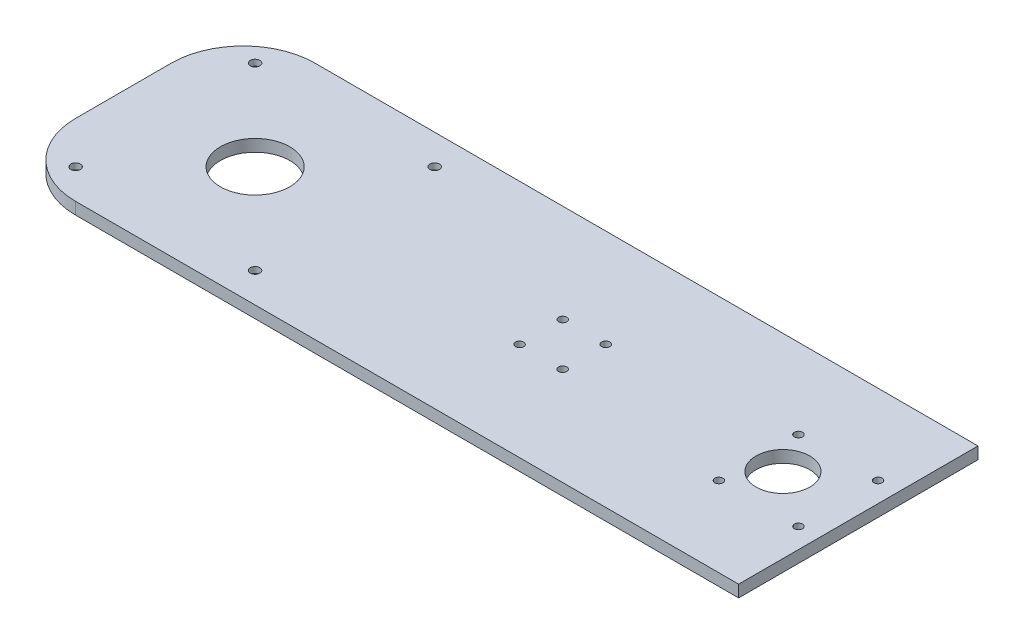
ISO-10303-21;
HEADER;
FILE_DESCRIPTION(('STEP AP214'),'2;1');
FILE_NAME('part.step','',(''),(''),'','','');
FILE_SCHEMA(('AUTOMOTIVE_DESIGN { 1 0 10303 214 1 1 1 1 }'));
ENDSEC;
DATA;
#1=APPLICATION_CONTEXT('core data for automotive mechanical design processes');
#2=APPLICATION_PROTOCOL_DEFINITION('international standard','automotive_design',2000,#1);
#3=PRODUCT_CONTEXT('',#1,'mechanical');
#4=PRODUCT('Part','Part','',(#3));
#5=PRODUCT_RELATED_PRODUCT_CATEGORY('part','',(#4));
#6=PRODUCT_DEFINITION_FORMATION('','',#4);
#7=PRODUCT_DEFINITION_CONTEXT('part definition',#1,'design');
#8=PRODUCT_DEFINITION('design','',#6,#7);
#9=PRODUCT_DEFINITION_SHAPE('','',#8);
#10=(LENGTH_UNIT() NAMED_UNIT(*) SI_UNIT(.MILLI.,.METRE.));
#11=(NAMED_UNIT(*) PLANE_ANGLE_UNIT() SI_UNIT($,.RADIAN.));
#12=(NAMED_UNIT(*) SI_UNIT($,.STERADIAN.) SOLID_ANGLE_UNIT());
#13=UNCERTAINTY_MEASURE_WITH_UNIT(LENGTH_MEASURE(1.E-05),#10,'distance_accuracy_value','');
#14=(GEOMETRIC_REPRESENTATION_CONTEXT(3) GLOBAL_UNCERTAINTY_ASSIGNED_CONTEXT((#13)) GLOBAL_UNIT_ASSIGNED_CONTEXT((#10,
#11,#12)) REPRESENTATION_CONTEXT('',''));
#15=CARTESIAN_POINT('',(0.,0.,0.));
#16=DIRECTION('',(0.,0.,1.));
#17=DIRECTION('',(1.,0.,0.));
#18=AXIS2_PLACEMENT_3D('',#15,#16,#17);
#19=CARTESIAN_POINT('',(-272.,0.,-75.));
#20=DIRECTION('',(0.,1.,0.));
#21=DIRECTION('',(0.,0.,1.));
#22=AXIS2_PLACEMENT_3D('',#19,#20,#21);
#23=CYLINDRICAL_SURFACE('',#22,3.99999999999999);
#24=CARTESIAN_POINT('',(-272.,10.,-75.));
#25=DIRECTION('',(0.,1.,0.));
#26=DIRECTION('',(0.,0.,1.));
#27=AXIS2_PLACEMENT_3D('',#24,#25,#26);
#28=CIRCLE('',#27,3.99999999999999);
#29=CARTESIAN_POINT('',(-272.,10.,-71.));
#30=VERTEX_POINT('',#29);
#31=EDGE_CURVE('E306',#30,#30,#28,.T.);
#32=ORIENTED_EDGE('',*,*,#31,.T.);
#33=EDGE_LOOP('',(#32));
#34=FACE_BOUND('',#33,.T.);
#35=CARTESIAN_POINT('',(-272.,5.,-75.));
#36=DIRECTION('',(0.,-1.,0.));
#37=DIRECTION('',(0.,0.,-1.));
#38=AXIS2_PLACEMENT_3D('',#35,#36,#37);
#39=CIRCLE('',#38,3.99999999999999);
#40=CARTESIAN_POINT('',(-272.,5.,-79.));
#41=VERTEX_POINT('',#40);
#42=EDGE_CURVE('E168',#41,#41,#39,.F.);
#43=ORIENTED_EDGE('',*,*,#42,.F.);
#44=EDGE_LOOP('',(#43));
#45=FACE_BOUND('',#44,.T.);
#46=ADVANCED_FACE('F45',(#34,#45),#23,.F.);
#47=CARTESIAN_POINT('',(-122.,0.,-75.0000000000001));
#48=DIRECTION('',(0.,1.,0.));
#49=DIRECTION('',(0.,0.,1.));
#50=AXIS2_PLACEMENT_3D('',#47,#48,#49);
#51=CYLINDRICAL_SURFACE('',#50,4.00000000000001);
#52=CARTESIAN_POINT('',(-122.,10.,-75.0000000000001));
#53=DIRECTION('',(0.,1.,0.));
#54=DIRECTION('',(0.,0.,-1.));
#55=AXIS2_PLACEMENT_3D('',#52,#53,#54);
#56=CIRCLE('',#55,4.00000000000001);
#57=CARTESIAN_POINT('',(-122.,10.,-79.0000000000001));
#58=VERTEX_POINT('',#57);
#59=EDGE_CURVE('E317',#58,#58,#56,.T.);
#60=ORIENTED_EDGE('',*,*,#59,.T.);
#61=EDGE_LOOP('',(#60));
#62=FACE_BOUND('',#61,.T.);
#63=CARTESIAN_POINT('',(-122.,5.,-75.0000000000001));
#64=DIRECTION('',(0.,-1.,0.));
#65=DIRECTION('',(0.,0.,-1.));
#66=AXIS2_PLACEMENT_3D('',#63,#64,#65);
#67=CIRCLE('',#66,4.00000000000001);
#68=CARTESIAN_POINT('',(-122.,5.,-79.0000000000001));
#69=VERTEX_POINT('',#68);
#70=EDGE_CURVE('E163',#69,#69,#67,.F.);
#71=ORIENTED_EDGE('',*,*,#70,.F.);
#72=EDGE_LOOP('',(#71));
#73=FACE_BOUND('',#72,.T.);
#74=ADVANCED_FACE('F227',(#62,#73),#51,.F.);
#75=CARTESIAN_POINT('',(-122.,0.,75.));
#76=DIRECTION('',(0.,1.,0.));
#77=DIRECTION('',(0.,0.,1.));
#78=AXIS2_PLACEMENT_3D('',#75,#76,#77);
#79=CYLINDRICAL_SURFACE('',#78,4.00000000000001);
#80=CARTESIAN_POINT('',(-122.,10.,75.));
#81=DIRECTION('',(0.,1.,0.));
#82=DIRECTION('',(0.,0.,1.));
#83=AXIS2_PLACEMENT_3D('',#80,#81,#82);
#84=CIRCLE('',#83,4.00000000000001);
#85=CARTESIAN_POINT('',(-122.,10.,79.));
#86=VERTEX_POINT('',#85);
#87=EDGE_CURVE('E313',#86,#86,#84,.T.);
#88=ORIENTED_EDGE('',*,*,#87,.T.);
#89=EDGE_LOOP('',(#88));
#90=FACE_BOUND('',#89,.T.);
#91=CARTESIAN_POINT('',(-122.,5.,75.));
#92=DIRECTION('',(0.,-1.,0.));
#93=DIRECTION('',(0.,0.,-1.));
#94=AXIS2_PLACEMENT_3D('',#91,#92,#93);
#95=CIRCLE('',#94,4.00000000000001);
#96=CARTESIAN_POINT('',(-122.,5.,71.));
#97=VERTEX_POINT('',#96);
#98=EDGE_CURVE('E159',#97,#97,#95,.F.);
#99=ORIENTED_EDGE('',*,*,#98,.F.);
#100=EDGE_LOOP('',(#99));
#101=FACE_BOUND('',#100,.T.);
#102=ADVANCED_FACE('F233',(#90,#101),#79,.F.);
#103=CARTESIAN_POINT('',(-272.,0.,75.));
#104=DIRECTION('',(0.,1.,0.));
#105=DIRECTION('',(0.,0.,1.));
#106=AXIS2_PLACEMENT_3D('',#103,#104,#105);
#107=CYLINDRICAL_SURFACE('',#106,3.99999999999999);
#108=CARTESIAN_POINT('',(-272.,10.,75.));
#109=DIRECTION('',(0.,1.,0.));
#110=DIRECTION('',(0.,0.,-1.));
#111=AXIS2_PLACEMENT_3D('',#108,#109,#110);
#112=CIRCLE('',#111,3.99999999999999);
#113=CARTESIAN_POINT('',(-272.,10.,71.));
#114=VERTEX_POINT('',#113);
#115=EDGE_CURVE('E309',#114,#114,#112,.T.);
#116=ORIENTED_EDGE('',*,*,#115,.T.);
#117=EDGE_LOOP('',(#116));
#118=FACE_BOUND('',#117,.T.);
#119=CARTESIAN_POINT('',(-272.,5.,75.));
#120=DIRECTION('',(0.,-1.,0.));
#121=DIRECTION('',(0.,0.,-1.));
#122=AXIS2_PLACEMENT_3D('',#119,#120,#121);
#123=CIRCLE('',#122,3.99999999999999);
#124=CARTESIAN_POINT('',(-272.,5.,71.));
#125=VERTEX_POINT('',#124);
#126=EDGE_CURVE('E153',#125,#125,#123,.F.);
#127=ORIENTED_EDGE('',*,*,#126,.F.);
#128=EDGE_LOOP('',(#127));
#129=FACE_BOUND('',#128,.T.);
#130=ADVANCED_FACE('F244',(#118,#129),#107,.F.);
#131=CARTESIAN_POINT('',(-307.,10.,100.));
#132=DIRECTION('',(1.,0.,0.));
#133=DIRECTION('',(0.,0.,-1.));
#134=AXIS2_PLACEMENT_3D('',#131,#132,#133);
#135=PLANE('',#134);
#136=DIRECTION('',(0.,0.,1.));
#137=VECTOR('',#136,1.);
#138=CARTESIAN_POINT('',(-307.,0.,100.));
#139=LINE('',#138,#137);
#140=CARTESIAN_POINT('',(-307.,0.,-40.));
#141=VERTEX_POINT('',#140);
#142=CARTESIAN_POINT('',(-307.,0.,40.));
#143=VERTEX_POINT('',#142);
#144=EDGE_CURVE('E133',#141,#143,#139,.T.);
#145=ORIENTED_EDGE('',*,*,#144,.T.);
#146=DIRECTION('',(0.,-1.,0.));
#147=VECTOR('',#146,1.);
#148=CARTESIAN_POINT('',(-307.,10.,40.));
#149=LINE('',#148,#147);
#150=CARTESIAN_POINT('',(-307.,10.,40.));
#151=VERTEX_POINT('',#150);
#152=EDGE_CURVE('E67',#143,#151,#149,.F.);
#153=ORIENTED_EDGE('',*,*,#152,.T.);
#154=DIRECTION('',(0.,0.,1.));
#155=VECTOR('',#154,1.);
#156=CARTESIAN_POINT('',(-307.,10.,100.));
#157=LINE('',#156,#155);
#158=CARTESIAN_POINT('',(-307.,10.,-40.));
#159=VERTEX_POINT('',#158);
#160=EDGE_CURVE('E111',#159,#151,#157,.T.);
#161=ORIENTED_EDGE('',*,*,#160,.F.);
#162=DIRECTION('',(0.,-1.,0.));
#163=VECTOR('',#162,1.);
#164=CARTESIAN_POINT('',(-307.,10.,-40.));
#165=LINE('',#164,#163);
#166=EDGE_CURVE('E197',#159,#141,#165,.T.);
#167=ORIENTED_EDGE('',*,*,#166,.T.);
#168=EDGE_LOOP('',(#145,#153,#161,#167));
#169=FACE_BOUND('',#168,.T.);
#170=ADVANCED_FACE('F209',(#169),#135,.F.);
#171=CARTESIAN_POINT('',(307.,10.,100.));
#172=DIRECTION('',(0.,0.,-1.));
#173=DIRECTION('',(-1.,0.,0.));
#174=AXIS2_PLACEMENT_3D('',#171,#172,#173);
#175=PLANE('',#174);
#176=DIRECTION('',(1.,0.,0.));
#177=VECTOR('',#176,1.);
#178=CARTESIAN_POINT('',(307.,10.,100.));
#179=LINE('',#178,#177);
#180=CARTESIAN_POINT('',(-247.,10.,100.));
#181=VERTEX_POINT('',#180);
#182=CARTESIAN_POINT('',(307.,10.,100.));
#183=VERTEX_POINT('',#182);
#184=EDGE_CURVE('E100',#181,#183,#179,.T.);
#185=ORIENTED_EDGE('',*,*,#184,.F.);
#186=DIRECTION('',(0.,-1.,0.));
#187=VECTOR('',#186,1.);
#188=CARTESIAN_POINT('',(-247.,10.,100.));
#189=LINE('',#188,#187);
#190=CARTESIAN_POINT('',(-247.,0.,100.));
#191=VERTEX_POINT('',#190);
#192=EDGE_CURVE('E121',#181,#191,#189,.T.);
#193=ORIENTED_EDGE('',*,*,#192,.T.);
#194=DIRECTION('',(1.,0.,0.));
#195=VECTOR('',#194,1.);
#196=CARTESIAN_POINT('',(307.,0.,100.));
#197=LINE('',#196,#195);
#198=CARTESIAN_POINT('',(307.,0.,100.));
#199=VERTEX_POINT('',#198);
#200=EDGE_CURVE('E117',#191,#199,#197,.T.);
#201=ORIENTED_EDGE('',*,*,#200,.T.);
#202=DIRECTION('',(0.,-1.,0.));
#203=VECTOR('',#202,1.);
#204=CARTESIAN_POINT('',(307.,10.,100.));
#205=LINE('',#204,#203);
#206=EDGE_CURVE('E114',#183,#199,#205,.T.);
#207=ORIENTED_EDGE('',*,*,#206,.F.);
#208=EDGE_LOOP('',(#185,#193,#201,#207));
#209=FACE_BOUND('',#208,.T.);
#210=ADVANCED_FACE('F115',(#209),#175,.F.);
#211=CARTESIAN_POINT('',(307.,10.,100.));
#212=DIRECTION('',(-1.,0.,0.));
#213=DIRECTION('',(0.,0.,1.));
#214=AXIS2_PLACEMENT_3D('',#211,#212,#213);
#215=PLANE('',#214);
#216=DIRECTION('',(0.,0.,-1.));
#217=VECTOR('',#216,1.);
#218=CARTESIAN_POINT('',(307.,0.,100.));
#219=LINE('',#218,#217);
#220=CARTESIAN_POINT('',(307.,0.,-100.));
#221=VERTEX_POINT('',#220);
#222=EDGE_CURVE('E139',#199,#221,#219,.T.);
#223=ORIENTED_EDGE('',*,*,#222,.T.);
#224=DIRECTION('',(0.,-1.,0.));
#225=VECTOR('',#224,1.);
#226=CARTESIAN_POINT('',(307.,10.,-100.));
#227=LINE('',#226,#225);
#228=CARTESIAN_POINT('',(307.,10.,-100.));
#229=VERTEX_POINT('',#228);
#230=EDGE_CURVE('E122',#229,#221,#227,.T.);
#231=ORIENTED_EDGE('',*,*,#230,.F.);
#232=DIRECTION('',(0.,0.,-1.));
#233=VECTOR('',#232,1.);
#234=CARTESIAN_POINT('',(307.,10.,100.));
#235=LINE('',#234,#233);
#236=EDGE_CURVE('E104',#183,#229,#235,.T.);
#237=ORIENTED_EDGE('',*,*,#236,.F.);
#238=ORIENTED_EDGE('',*,*,#206,.T.);
#239=EDGE_LOOP('',(#223,#231,#237,#238));
#240=FACE_BOUND('',#239,.T.);
#241=ADVANCED_FACE('F124',(#240),#215,.F.);
#242=CARTESIAN_POINT('',(307.,10.,-100.));
#243=DIRECTION('',(0.,0.,1.));
#244=DIRECTION('',(1.,0.,0.));
#245=AXIS2_PLACEMENT_3D('',#242,#243,#244);
#246=PLANE('',#245);
#247=DIRECTION('',(-1.,0.,0.));
#248=VECTOR('',#247,1.);
#249=CARTESIAN_POINT('',(307.,0.,-100.));
#250=LINE('',#249,#248);
#251=CARTESIAN_POINT('',(-247.,0.,-100.));
#252=VERTEX_POINT('',#251);
#253=EDGE_CURVE('E142',#221,#252,#250,.T.);
#254=ORIENTED_EDGE('',*,*,#253,.T.);
#255=DIRECTION('',(0.,-1.,0.));
#256=VECTOR('',#255,1.);
#257=CARTESIAN_POINT('',(-247.,10.,-100.));
#258=LINE('',#257,#256);
#259=CARTESIAN_POINT('',(-247.,10.,-100.));
#260=VERTEX_POINT('',#259);
#261=EDGE_CURVE('E11',#252,#260,#258,.F.);
#262=ORIENTED_EDGE('',*,*,#261,.T.);
#263=DIRECTION('',(-1.,0.,0.));
#264=VECTOR('',#263,1.);
#265=CARTESIAN_POINT('',(307.,10.,-100.));
#266=LINE('',#265,#264);
#267=EDGE_CURVE('E127',#229,#260,#266,.T.);
#268=ORIENTED_EDGE('',*,*,#267,.F.);
#269=ORIENTED_EDGE('',*,*,#230,.T.);
#270=EDGE_LOOP('',(#254,#262,#268,#269));
#271=FACE_BOUND('',#270,.T.);
#272=ADVANCED_FACE('F215',(#271),#246,.F.);
#273=CARTESIAN_POINT('',(0.,10.,0.));
#274=DIRECTION('',(0.,1.,0.));
#275=DIRECTION('',(0.,0.,1.));
#276=AXIS2_PLACEMENT_3D('',#273,#274,#275);
#277=PLANE('',#276);
#278=CARTESIAN_POINT('',(42.,10.,-18.));
#279=DIRECTION('',(0.,1.,0.));
#280=DIRECTION('',(0.,0.,1.));
#281=AXIS2_PLACEMENT_3D('',#278,#279,#280);
#282=CIRCLE('',#281,3.39999999999999);
#283=CARTESIAN_POINT('',(42.,10.,-14.6));
#284=VERTEX_POINT('',#283);
#285=EDGE_CURVE('E188',#284,#284,#282,.T.);
#286=ORIENTED_EDGE('',*,*,#285,.F.);
#287=EDGE_LOOP('',(#286));
#288=FACE_BOUND('',#287,.T.);
#289=CARTESIAN_POINT('',(78.,10.,-18.));
#290=DIRECTION('',(0.,1.,0.));
#291=DIRECTION('',(0.,0.,1.));
#292=AXIS2_PLACEMENT_3D('',#289,#290,#291);
#293=CIRCLE('',#292,3.39999999999999);
#294=CARTESIAN_POINT('',(78.,10.,-14.6));
#295=VERTEX_POINT('',#294);
#296=EDGE_CURVE('E183',#295,#295,#293,.T.);
#297=ORIENTED_EDGE('',*,*,#296,.F.);
#298=EDGE_LOOP('',(#297));
#299=FACE_BOUND('',#298,.T.);
#300=CARTESIAN_POINT('',(42.,10.,18.));
#301=DIRECTION('',(0.,1.,0.));
#302=DIRECTION('',(0.,0.,1.));
#303=AXIS2_PLACEMENT_3D('',#300,#301,#302);
#304=CIRCLE('',#303,3.39999999999999);
#305=CARTESIAN_POINT('',(42.,10.,21.4));
#306=VERTEX_POINT('',#305);
#307=EDGE_CURVE('E178',#306,#306,#304,.T.);
#308=ORIENTED_EDGE('',*,*,#307,.F.);
#309=EDGE_LOOP('',(#308));
#310=FACE_BOUND('',#309,.T.);
#311=CARTESIAN_POINT('',(78.,10.,18.));
#312=DIRECTION('',(0.,1.,0.));
#313=DIRECTION('',(0.,0.,1.));
#314=AXIS2_PLACEMENT_3D('',#311,#312,#313);
#315=CIRCLE('',#314,3.39999999999999);
#316=CARTESIAN_POINT('',(78.,10.,21.4));
#317=VERTEX_POINT('',#316);
#318=EDGE_CURVE('E177',#317,#317,#315,.T.);
#319=ORIENTED_EDGE('',*,*,#318,.F.);
#320=EDGE_LOOP('',(#319));
#321=FACE_BOUND('',#320,.T.);
#322=CARTESIAN_POINT('',(244.,10.,0.));
#323=DIRECTION('',(0.,1.,0.));
#324=DIRECTION('',(0.,0.,1.));
#325=AXIS2_PLACEMENT_3D('',#322,#323,#324);
#326=CIRCLE('',#325,22.5);
#327=CARTESIAN_POINT('',(244.,10.,22.5));
#328=VERTEX_POINT('',#327);
#329=EDGE_CURVE('E157',#328,#328,#326,.T.);
#330=ORIENTED_EDGE('',*,*,#329,.F.);
#331=EDGE_LOOP('',(#330));
#332=FACE_BOUND('',#331,.T.);
#333=CARTESIAN_POINT('',(223.765981284232,10.,-33.2340187157678));
#334=DIRECTION('',(0.,1.,0.));
#335=DIRECTION('',(0.,0.,1.));
#336=AXIS2_PLACEMENT_3D('',#333,#334,#335);
#337=CIRCLE('',#336,3.39999999999999);
#338=CARTESIAN_POINT('',(223.765981284232,10.,-29.8340187157678));
#339=VERTEX_POINT('',#338);
#340=EDGE_CURVE('E339',#339,#339,#337,.T.);
#341=ORIENTED_EDGE('',*,*,#340,.F.);
#342=EDGE_LOOP('',(#341));
#343=FACE_BOUND('',#342,.T.);
#344=CARTESIAN_POINT('',(290.234018715768,10.,-33.2340187157678));
#345=DIRECTION('',(0.,1.,0.));
#346=DIRECTION('',(0.,0.,1.));
#347=AXIS2_PLACEMENT_3D('',#344,#345,#346);
#348=CIRCLE('',#347,3.40000000000001);
#349=CARTESIAN_POINT('',(290.234018715768,10.,-29.8340187157678));
#350=VERTEX_POINT('',#349);
#351=EDGE_CURVE('E333',#350,#350,#348,.T.);
#352=ORIENTED_EDGE('',*,*,#351,.F.);
#353=EDGE_LOOP('',(#352));
#354=FACE_BOUND('',#353,.T.);
#355=CARTESIAN_POINT('',(223.765981284232,10.,33.2340187157678));
#356=DIRECTION('',(0.,1.,0.));
#357=DIRECTION('',(0.,0.,1.));
#358=AXIS2_PLACEMENT_3D('',#355,#356,#357);
#359=CIRCLE('',#358,3.39999999999999);
#360=CARTESIAN_POINT('',(223.765981284232,10.,36.6340187157677));
#361=VERTEX_POINT('',#360);
#362=EDGE_CURVE('E152',#361,#361,#359,.T.);
#363=ORIENTED_EDGE('',*,*,#362,.F.);
#364=EDGE_LOOP('',(#363));
#365=FACE_BOUND('',#364,.T.);
#366=CARTESIAN_POINT('',(290.234018715768,10.,33.2340187157678));
#367=DIRECTION('',(0.,1.,0.));
#368=DIRECTION('',(0.,0.,1.));
#369=AXIS2_PLACEMENT_3D('',#366,#367,#368);
#370=CIRCLE('',#369,3.40000000000001);
#371=CARTESIAN_POINT('',(290.234018715768,10.,36.6340187157678));
#372=VERTEX_POINT('',#371);
#373=EDGE_CURVE('E151',#372,#372,#370,.T.);
#374=ORIENTED_EDGE('',*,*,#373,.F.);
#375=EDGE_LOOP('',(#374));
#376=FACE_BOUND('',#375,.T.);
#377=ORIENTED_EDGE('',*,*,#115,.F.);
#378=EDGE_LOOP('',(#377));
#379=FACE_BOUND('',#378,.T.);
#380=ORIENTED_EDGE('',*,*,#87,.F.);
#381=EDGE_LOOP('',(#380));
#382=FACE_BOUND('',#381,.T.);
#383=ORIENTED_EDGE('',*,*,#59,.F.);
#384=EDGE_LOOP('',(#383));
#385=FACE_BOUND('',#384,.T.);
#386=ORIENTED_EDGE('',*,*,#31,.F.);
#387=EDGE_LOOP('',(#386));
#388=FACE_BOUND('',#387,.T.);
#389=CARTESIAN_POINT('',(-197.,10.,-1.11022302462516E-13));
#390=DIRECTION('',(0.,1.,0.));
#391=DIRECTION('',(0.,0.,1.));
#392=AXIS2_PLACEMENT_3D('',#389,#390,#391);
#393=CIRCLE('',#392,29.);
#394=CARTESIAN_POINT('',(-197.,10.,28.9999999999999));
#395=VERTEX_POINT('',#394);
#396=EDGE_CURVE('E302',#395,#395,#393,.T.);
#397=ORIENTED_EDGE('',*,*,#396,.F.);
#398=EDGE_LOOP('',(#397));
#399=FACE_BOUND('',#398,.T.);
#400=ORIENTED_EDGE('',*,*,#160,.T.);
#401=CARTESIAN_POINT('',(-247.,10.,40.));
#402=DIRECTION('',(0.,1.,0.));
#403=DIRECTION('',(0.,0.,1.));
#404=AXIS2_PLACEMENT_3D('',#401,#402,#403);
#405=CIRCLE('',#404,60.);
#406=EDGE_CURVE('E54',#151,#181,#405,.T.);
#407=ORIENTED_EDGE('',*,*,#406,.T.);
#408=ORIENTED_EDGE('',*,*,#184,.T.);
#409=ORIENTED_EDGE('',*,*,#236,.T.);
#410=ORIENTED_EDGE('',*,*,#267,.T.);
#411=CARTESIAN_POINT('',(-247.,10.,-40.));
#412=DIRECTION('',(0.,1.,0.));
#413=DIRECTION('',(0.,0.,1.));
#414=AXIS2_PLACEMENT_3D('',#411,#412,#413);
#415=CIRCLE('',#414,60.);
#416=EDGE_CURVE('E203',#260,#159,#415,.T.);
#417=ORIENTED_EDGE('',*,*,#416,.T.);
#418=EDGE_LOOP('',(#400,#407,#408,#409,#410,#417));
#419=FACE_BOUND('',#418,.T.);
#420=ADVANCED_FACE('F102',(#288,#299,#310,#321,#332,#343,#354,#365,#376,#379,#382,#385,#388,
#399,#419),#277,.T.);
#421=CARTESIAN_POINT('',(0.,0.,0.));
#422=DIRECTION('',(0.,1.,0.));
#423=DIRECTION('',(0.,0.,1.));
#424=AXIS2_PLACEMENT_3D('',#421,#422,#423);
#425=PLANE('',#424);
#426=CARTESIAN_POINT('',(42.,0.,-18.));
#427=DIRECTION('',(0.,1.,0.));
#428=DIRECTION('',(0.,0.,1.));
#429=AXIS2_PLACEMENT_3D('',#426,#427,#428);
#430=CIRCLE('',#429,3.39999999999999);
#431=CARTESIAN_POINT('',(42.,0.,-14.6));
#432=VERTEX_POINT('',#431);
#433=EDGE_CURVE('E184',#432,#432,#430,.T.);
#434=ORIENTED_EDGE('',*,*,#433,.T.);
#435=EDGE_LOOP('',(#434));
#436=FACE_BOUND('',#435,.T.);
#437=CARTESIAN_POINT('',(78.,0.,-18.));
#438=DIRECTION('',(0.,1.,0.));
#439=DIRECTION('',(0.,0.,1.));
#440=AXIS2_PLACEMENT_3D('',#437,#438,#439);
#441=CIRCLE('',#440,3.39999999999999);
#442=CARTESIAN_POINT('',(78.,0.,-14.6));
#443=VERTEX_POINT('',#442);
#444=EDGE_CURVE('E179',#443,#443,#441,.T.);
#445=ORIENTED_EDGE('',*,*,#444,.T.);
#446=EDGE_LOOP('',(#445));
#447=FACE_BOUND('',#446,.T.);
#448=CARTESIAN_POINT('',(42.,0.,18.));
#449=DIRECTION('',(0.,1.,0.));
#450=DIRECTION('',(0.,0.,1.));
#451=AXIS2_PLACEMENT_3D('',#448,#449,#450);
#452=CIRCLE('',#451,3.39999999999999);
#453=CARTESIAN_POINT('',(42.,0.,21.4));
#454=VERTEX_POINT('',#453);
#455=EDGE_CURVE('E173',#454,#454,#452,.T.);
#456=ORIENTED_EDGE('',*,*,#455,.T.);
#457=EDGE_LOOP('',(#456));
#458=FACE_BOUND('',#457,.T.);
#459=CARTESIAN_POINT('',(78.,0.,18.));
#460=DIRECTION('',(0.,1.,0.));
#461=DIRECTION('',(0.,0.,1.));
#462=AXIS2_PLACEMENT_3D('',#459,#460,#461);
#463=CIRCLE('',#462,3.39999999999999);
#464=CARTESIAN_POINT('',(78.,0.,21.4));
#465=VERTEX_POINT('',#464);
#466=EDGE_CURVE('E265',#465,#465,#463,.T.);
#467=ORIENTED_EDGE('',*,*,#466,.T.);
#468=EDGE_LOOP('',(#467));
#469=FACE_BOUND('',#468,.T.);
#470=CARTESIAN_POINT('',(-272.,0.,-75.));
#471=DIRECTION('',(0.,-1.,0.));
#472=DIRECTION('',(0.,0.,-1.));
#473=AXIS2_PLACEMENT_3D('',#470,#471,#472);
#474=CIRCLE('',#473,8.99999999999999);
#475=CARTESIAN_POINT('',(-272.,0.,-84.));
#476=VERTEX_POINT('',#475);
#477=EDGE_CURVE('E269',#476,#476,#474,.T.);
#478=ORIENTED_EDGE('',*,*,#477,.F.);
#479=EDGE_LOOP('',(#478));
#480=FACE_BOUND('',#479,.T.);
#481=CARTESIAN_POINT('',(-122.,0.,75.));
#482=DIRECTION('',(0.,-1.,0.));
#483=DIRECTION('',(0.,0.,-1.));
#484=AXIS2_PLACEMENT_3D('',#481,#482,#483);
#485=CIRCLE('',#484,8.99999999999999);
#486=CARTESIAN_POINT('',(-122.,0.,66.));
#487=VERTEX_POINT('',#486);
#488=EDGE_CURVE('E273',#487,#487,#485,.T.);
#489=ORIENTED_EDGE('',*,*,#488,.F.);
#490=EDGE_LOOP('',(#489));
#491=FACE_BOUND('',#490,.T.);
#492=CARTESIAN_POINT('',(-122.,0.,-75.0000000000001));
#493=DIRECTION('',(0.,-1.,0.));
#494=DIRECTION('',(0.,0.,-1.));
#495=AXIS2_PLACEMENT_3D('',#492,#493,#494);
#496=CIRCLE('',#495,8.99999999999999);
#497=CARTESIAN_POINT('',(-122.,0.,-84.));
#498=VERTEX_POINT('',#497);
#499=EDGE_CURVE('E277',#498,#498,#496,.T.);
#500=ORIENTED_EDGE('',*,*,#499,.F.);
#501=EDGE_LOOP('',(#500));
#502=FACE_BOUND('',#501,.T.);
#503=CARTESIAN_POINT('',(-272.,0.,75.));
#504=DIRECTION('',(0.,-1.,0.));
#505=DIRECTION('',(0.,0.,-1.));
#506=AXIS2_PLACEMENT_3D('',#503,#504,#505);
#507=CIRCLE('',#506,8.99999999999999);
#508=CARTESIAN_POINT('',(-272.,0.,66.));
#509=VERTEX_POINT('',#508);
#510=EDGE_CURVE('E172',#509,#509,#507,.T.);
#511=ORIENTED_EDGE('',*,*,#510,.F.);
#512=EDGE_LOOP('',(#511));
#513=FACE_BOUND('',#512,.T.);
#514=CARTESIAN_POINT('',(244.,0.,0.));
#515=DIRECTION('',(0.,1.,0.));
#516=DIRECTION('',(0.,0.,1.));
#517=AXIS2_PLACEMENT_3D('',#514,#515,#516);
#518=CIRCLE('',#517,22.5);
#519=CARTESIAN_POINT('',(244.,0.,22.5));
#520=VERTEX_POINT('',#519);
#521=EDGE_CURVE('E284',#520,#520,#518,.T.);
#522=ORIENTED_EDGE('',*,*,#521,.T.);
#523=EDGE_LOOP('',(#522));
#524=FACE_BOUND('',#523,.T.);
#525=CARTESIAN_POINT('',(223.765981284232,0.,-33.2340187157678));
#526=DIRECTION('',(0.,1.,0.));
#527=DIRECTION('',(0.,0.,1.));
#528=AXIS2_PLACEMENT_3D('',#525,#526,#527);
#529=CIRCLE('',#528,3.39999999999999);
#530=CARTESIAN_POINT('',(223.765981284232,0.,-29.8340187157678));
#531=VERTEX_POINT('',#530);
#532=EDGE_CURVE('E288',#531,#531,#529,.T.);
#533=ORIENTED_EDGE('',*,*,#532,.T.);
#534=EDGE_LOOP('',(#533));
#535=FACE_BOUND('',#534,.T.);
#536=CARTESIAN_POINT('',(290.234018715768,0.,-33.2340187157678));
#537=DIRECTION('',(0.,1.,0.));
#538=DIRECTION('',(0.,0.,1.));
#539=AXIS2_PLACEMENT_3D('',#536,#537,#538);
#540=CIRCLE('',#539,3.40000000000001);
#541=CARTESIAN_POINT('',(290.234018715768,0.,-29.8340187157678));
#542=VERTEX_POINT('',#541);
#543=EDGE_CURVE('E292',#542,#542,#540,.T.);
#544=ORIENTED_EDGE('',*,*,#543,.T.);
#545=EDGE_LOOP('',(#544));
#546=FACE_BOUND('',#545,.T.);
#547=CARTESIAN_POINT('',(223.765981284232,0.,33.2340187157678));
#548=DIRECTION('',(0.,1.,0.));
#549=DIRECTION('',(0.,0.,1.));
#550=AXIS2_PLACEMENT_3D('',#547,#548,#549);
#551=CIRCLE('',#550,3.39999999999999);
#552=CARTESIAN_POINT('',(223.765981284232,0.,36.6340187157677));
#553=VERTEX_POINT('',#552);
#554=EDGE_CURVE('E147',#553,#553,#551,.T.);
#555=ORIENTED_EDGE('',*,*,#554,.T.);
#556=EDGE_LOOP('',(#555));
#557=FACE_BOUND('',#556,.T.);
#558=CARTESIAN_POINT('',(290.234018715768,0.,33.2340187157678));
#559=DIRECTION('',(0.,1.,0.));
#560=DIRECTION('',(0.,0.,1.));
#561=AXIS2_PLACEMENT_3D('',#558,#559,#560);
#562=CIRCLE('',#561,3.40000000000001);
#563=CARTESIAN_POINT('',(290.234018715768,0.,36.6340187157678));
#564=VERTEX_POINT('',#563);
#565=EDGE_CURVE('E298',#564,#564,#562,.T.);
#566=ORIENTED_EDGE('',*,*,#565,.T.);
#567=EDGE_LOOP('',(#566));
#568=FACE_BOUND('',#567,.T.);
#569=CARTESIAN_POINT('',(-197.,0.,-1.11022302462516E-13));
#570=DIRECTION('',(0.,1.,0.));
#571=DIRECTION('',(0.,0.,1.));
#572=AXIS2_PLACEMENT_3D('',#569,#570,#571);
#573=CIRCLE('',#572,29.);
#574=CARTESIAN_POINT('',(-197.,0.,28.9999999999999));
#575=VERTEX_POINT('',#574);
#576=EDGE_CURVE('E136',#575,#575,#573,.T.);
#577=ORIENTED_EDGE('',*,*,#576,.T.);
#578=EDGE_LOOP('',(#577));
#579=FACE_BOUND('',#578,.T.);
#580=ORIENTED_EDGE('',*,*,#200,.F.);
#581=CARTESIAN_POINT('',(-247.,0.,40.));
#582=DIRECTION('',(0.,1.,0.));
#583=DIRECTION('',(0.,0.,1.));
#584=AXIS2_PLACEMENT_3D('',#581,#582,#583);
#585=CIRCLE('',#584,60.);
#586=EDGE_CURVE('E194',#191,#143,#585,.F.);
#587=ORIENTED_EDGE('',*,*,#586,.T.);
#588=ORIENTED_EDGE('',*,*,#144,.F.);
#589=CARTESIAN_POINT('',(-247.,0.,-40.));
#590=DIRECTION('',(0.,1.,0.));
#591=DIRECTION('',(0.,0.,1.));
#592=AXIS2_PLACEMENT_3D('',#589,#590,#591);
#593=CIRCLE('',#592,60.);
#594=EDGE_CURVE('E191',#141,#252,#593,.F.);
#595=ORIENTED_EDGE('',*,*,#594,.T.);
#596=ORIENTED_EDGE('',*,*,#253,.F.);
#597=ORIENTED_EDGE('',*,*,#222,.F.);
#598=EDGE_LOOP('',(#580,#587,#588,#595,#596,#597));
#599=FACE_BOUND('',#598,.T.);
#600=ADVANCED_FACE('F214',(#436,#447,#458,#469,#480,#491,#502,#513,#524,#535,#546,#557,#568,
#579,#599),#425,.F.);
#601=CARTESIAN_POINT('',(-197.,0.,-1.11022302462516E-13));
#602=DIRECTION('',(0.,1.,0.));
#603=DIRECTION('',(0.,0.,1.));
#604=AXIS2_PLACEMENT_3D('',#601,#602,#603);
#605=CYLINDRICAL_SURFACE('',#604,29.);
#606=ORIENTED_EDGE('',*,*,#576,.F.);
#607=EDGE_LOOP('',(#606));
#608=FACE_BOUND('',#607,.T.);
#609=ORIENTED_EDGE('',*,*,#396,.T.);
#610=EDGE_LOOP('',(#609));
#611=FACE_BOUND('',#610,.T.);
#612=ADVANCED_FACE('F249',(#608,#611),#605,.F.);
#613=CARTESIAN_POINT('',(290.234018715768,10.,33.2340187157678));
#614=DIRECTION('',(0.,1.,0.));
#615=DIRECTION('',(0.,0.,1.));
#616=AXIS2_PLACEMENT_3D('',#613,#614,#615);
#617=CYLINDRICAL_SURFACE('',#616,3.40000000000001);
#618=ORIENTED_EDGE('',*,*,#373,.T.);
#619=EDGE_LOOP('',(#618));
#620=FACE_BOUND('',#619,.T.);
#621=ORIENTED_EDGE('',*,*,#565,.F.);
#622=EDGE_LOOP('',(#621));
#623=FACE_BOUND('',#622,.T.);
#624=ADVANCED_FACE('F239',(#620,#623),#617,.F.);
#625=CARTESIAN_POINT('',(223.765981284232,10.,33.2340187157678));
#626=DIRECTION('',(0.,1.,0.));
#627=DIRECTION('',(0.,0.,1.));
#628=AXIS2_PLACEMENT_3D('',#625,#626,#627);
#629=CYLINDRICAL_SURFACE('',#628,3.39999999999999);
#630=ORIENTED_EDGE('',*,*,#362,.T.);
#631=EDGE_LOOP('',(#630));
#632=FACE_BOUND('',#631,.T.);
#633=ORIENTED_EDGE('',*,*,#554,.F.);
#634=EDGE_LOOP('',(#633));
#635=FACE_BOUND('',#634,.T.);
#636=ADVANCED_FACE('F453',(#632,#635),#629,.F.);
#637=CARTESIAN_POINT('',(290.234018715768,10.,-33.2340187157678));
#638=DIRECTION('',(0.,1.,0.));
#639=DIRECTION('',(0.,0.,1.));
#640=AXIS2_PLACEMENT_3D('',#637,#638,#639);
#641=CYLINDRICAL_SURFACE('',#640,3.40000000000001);
#642=ORIENTED_EDGE('',*,*,#351,.T.);
#643=EDGE_LOOP('',(#642));
#644=FACE_BOUND('',#643,.T.);
#645=ORIENTED_EDGE('',*,*,#543,.F.);
#646=EDGE_LOOP('',(#645));
#647=FACE_BOUND('',#646,.T.);
#648=ADVANCED_FACE('F450',(#644,#647),#641,.F.);
#649=CARTESIAN_POINT('',(223.765981284232,10.,-33.2340187157678));
#650=DIRECTION('',(0.,1.,0.));
#651=DIRECTION('',(0.,0.,1.));
#652=AXIS2_PLACEMENT_3D('',#649,#650,#651);
#653=CYLINDRICAL_SURFACE('',#652,3.39999999999999);
#654=ORIENTED_EDGE('',*,*,#340,.T.);
#655=EDGE_LOOP('',(#654));
#656=FACE_BOUND('',#655,.T.);
#657=ORIENTED_EDGE('',*,*,#532,.F.);
#658=EDGE_LOOP('',(#657));
#659=FACE_BOUND('',#658,.T.);
#660=ADVANCED_FACE('F446',(#656,#659),#653,.F.);
#661=CARTESIAN_POINT('',(244.,0.,0.));
#662=DIRECTION('',(0.,1.,0.));
#663=DIRECTION('',(0.,0.,1.));
#664=AXIS2_PLACEMENT_3D('',#661,#662,#663);
#665=CYLINDRICAL_SURFACE('',#664,22.5);
#666=ORIENTED_EDGE('',*,*,#521,.F.);
#667=EDGE_LOOP('',(#666));
#668=FACE_BOUND('',#667,.T.);
#669=ORIENTED_EDGE('',*,*,#329,.T.);
#670=EDGE_LOOP('',(#669));
#671=FACE_BOUND('',#670,.T.);
#672=ADVANCED_FACE('F439',(#668,#671),#665,.F.);
#673=CARTESIAN_POINT('',(-272.,5.,75.));
#674=DIRECTION('',(0.,-1.,0.));
#675=DIRECTION('',(0.,0.,-1.));
#676=AXIS2_PLACEMENT_3D('',#673,#674,#675);
#677=PLANE('',#676);
#678=CARTESIAN_POINT('',(-272.,5.,75.));
#679=DIRECTION('',(0.,-1.,0.));
#680=DIRECTION('',(0.,0.,-1.));
#681=AXIS2_PLACEMENT_3D('',#678,#679,#680);
#682=CIRCLE('',#681,8.99999999999999);
#683=CARTESIAN_POINT('',(-272.,5.,66.));
#684=VERTEX_POINT('',#683);
#685=EDGE_CURVE('E158',#684,#684,#682,.T.);
#686=ORIENTED_EDGE('',*,*,#685,.T.);
#687=EDGE_LOOP('',(#686));
#688=FACE_BOUND('',#687,.T.);
#689=ORIENTED_EDGE('',*,*,#126,.T.);
#690=EDGE_LOOP('',(#689));
#691=FACE_BOUND('',#690,.T.);
#692=ADVANCED_FACE('F435',(#688,#691),#677,.T.);
#693=CARTESIAN_POINT('',(-272.,5.,75.));
#694=DIRECTION('',(0.,-1.,0.));
#695=DIRECTION('',(0.,0.,-1.));
#696=AXIS2_PLACEMENT_3D('',#693,#694,#695);
#697=CYLINDRICAL_SURFACE('',#696,8.99999999999999);
#698=ORIENTED_EDGE('',*,*,#685,.F.);
#699=EDGE_LOOP('',(#698));
#700=FACE_BOUND('',#699,.T.);
#701=ORIENTED_EDGE('',*,*,#510,.T.);
#702=EDGE_LOOP('',(#701));
#703=FACE_BOUND('',#702,.T.);
#704=ADVANCED_FACE('F438',(#700,#703),#697,.F.);
#705=CARTESIAN_POINT('',(-122.,5.,75.));
#706=DIRECTION('',(0.,-1.,0.));
#707=DIRECTION('',(0.,0.,-1.));
#708=AXIS2_PLACEMENT_3D('',#705,#706,#707);
#709=PLANE('',#708);
#710=CARTESIAN_POINT('',(-122.,5.,75.));
#711=DIRECTION('',(0.,-1.,0.));
#712=DIRECTION('',(0.,0.,-1.));
#713=AXIS2_PLACEMENT_3D('',#710,#711,#712);
#714=CIRCLE('',#713,8.99999999999999);
#715=CARTESIAN_POINT('',(-122.,5.,66.));
#716=VERTEX_POINT('',#715);
#717=EDGE_CURVE('E361',#716,#716,#714,.T.);
#718=ORIENTED_EDGE('',*,*,#717,.T.);
#719=EDGE_LOOP('',(#718));
#720=FACE_BOUND('',#719,.T.);
#721=ORIENTED_EDGE('',*,*,#98,.T.);
#722=EDGE_LOOP('',(#721));
#723=FACE_BOUND('',#722,.T.);
#724=ADVANCED_FACE('F430',(#720,#723),#709,.T.);
#725=CARTESIAN_POINT('',(-122.,5.,75.));
#726=DIRECTION('',(0.,-1.,0.));
#727=DIRECTION('',(0.,0.,-1.));
#728=AXIS2_PLACEMENT_3D('',#725,#726,#727);
#729=CYLINDRICAL_SURFACE('',#728,8.99999999999999);
#730=ORIENTED_EDGE('',*,*,#717,.F.);
#731=EDGE_LOOP('',(#730));
#732=FACE_BOUND('',#731,.T.);
#733=ORIENTED_EDGE('',*,*,#488,.T.);
#734=EDGE_LOOP('',(#733));
#735=FACE_BOUND('',#734,.T.);
#736=ADVANCED_FACE('F420',(#732,#735),#729,.F.);
#737=CARTESIAN_POINT('',(-122.,5.,-75.0000000000001));
#738=DIRECTION('',(0.,-1.,0.));
#739=DIRECTION('',(0.,0.,-1.));
#740=AXIS2_PLACEMENT_3D('',#737,#738,#739);
#741=PLANE('',#740);
#742=CARTESIAN_POINT('',(-122.,5.,-75.0000000000001));
#743=DIRECTION('',(0.,-1.,0.));
#744=DIRECTION('',(0.,0.,-1.));
#745=AXIS2_PLACEMENT_3D('',#742,#743,#744);
#746=CIRCLE('',#745,8.99999999999999);
#747=CARTESIAN_POINT('',(-122.,5.,-84.));
#748=VERTEX_POINT('',#747);
#749=EDGE_CURVE('E355',#748,#748,#746,.T.);
#750=ORIENTED_EDGE('',*,*,#749,.T.);
#751=EDGE_LOOP('',(#750));
#752=FACE_BOUND('',#751,.T.);
#753=ORIENTED_EDGE('',*,*,#70,.T.);
#754=EDGE_LOOP('',(#753));
#755=FACE_BOUND('',#754,.T.);
#756=ADVANCED_FACE('F417',(#752,#755),#741,.T.);
#757=CARTESIAN_POINT('',(-122.,5.,-75.0000000000001));
#758=DIRECTION('',(0.,-1.,0.));
#759=DIRECTION('',(0.,0.,-1.));
#760=AXIS2_PLACEMENT_3D('',#757,#758,#759);
#761=CYLINDRICAL_SURFACE('',#760,8.99999999999999);
#762=ORIENTED_EDGE('',*,*,#749,.F.);
#763=EDGE_LOOP('',(#762));
#764=FACE_BOUND('',#763,.T.);
#765=ORIENTED_EDGE('',*,*,#499,.T.);
#766=EDGE_LOOP('',(#765));
#767=FACE_BOUND('',#766,.T.);
#768=ADVANCED_FACE('F419',(#764,#767),#761,.F.);
#769=CARTESIAN_POINT('',(-272.,5.,-75.));
#770=DIRECTION('',(0.,-1.,0.));
#771=DIRECTION('',(0.,0.,-1.));
#772=AXIS2_PLACEMENT_3D('',#769,#770,#771);
#773=PLANE('',#772);
#774=CARTESIAN_POINT('',(-272.,5.,-75.));
#775=DIRECTION('',(0.,-1.,0.));
#776=DIRECTION('',(0.,0.,-1.));
#777=AXIS2_PLACEMENT_3D('',#774,#775,#776);
#778=CIRCLE('',#777,8.99999999999999);
#779=CARTESIAN_POINT('',(-272.,5.,-84.));
#780=VERTEX_POINT('',#779);
#781=EDGE_CURVE('E164',#780,#780,#778,.T.);
#782=ORIENTED_EDGE('',*,*,#781,.T.);
#783=EDGE_LOOP('',(#782));
#784=FACE_BOUND('',#783,.T.);
#785=ORIENTED_EDGE('',*,*,#42,.T.);
#786=EDGE_LOOP('',(#785));
#787=FACE_BOUND('',#786,.T.);
#788=ADVANCED_FACE('F427',(#784,#787),#773,.T.);
#789=CARTESIAN_POINT('',(-272.,5.,-75.));
#790=DIRECTION('',(0.,-1.,0.));
#791=DIRECTION('',(0.,0.,-1.));
#792=AXIS2_PLACEMENT_3D('',#789,#790,#791);
#793=CYLINDRICAL_SURFACE('',#792,8.99999999999999);
#794=ORIENTED_EDGE('',*,*,#781,.F.);
#795=EDGE_LOOP('',(#794));
#796=FACE_BOUND('',#795,.T.);
#797=ORIENTED_EDGE('',*,*,#477,.T.);
#798=EDGE_LOOP('',(#797));
#799=FACE_BOUND('',#798,.T.);
#800=ADVANCED_FACE('F640',(#796,#799),#793,.F.);
#801=CARTESIAN_POINT('',(78.,10.,18.));
#802=DIRECTION('',(0.,1.,0.));
#803=DIRECTION('',(0.,0.,1.));
#804=AXIS2_PLACEMENT_3D('',#801,#802,#803);
#805=CYLINDRICAL_SURFACE('',#804,3.39999999999999);
#806=ORIENTED_EDGE('',*,*,#318,.T.);
#807=EDGE_LOOP('',(#806));
#808=FACE_BOUND('',#807,.T.);
#809=ORIENTED_EDGE('',*,*,#466,.F.);
#810=EDGE_LOOP('',(#809));
#811=FACE_BOUND('',#810,.T.);
#812=ADVANCED_FACE('F630',(#808,#811),#805,.F.);
#813=CARTESIAN_POINT('',(42.,10.,18.));
#814=DIRECTION('',(0.,1.,0.));
#815=DIRECTION('',(0.,0.,1.));
#816=AXIS2_PLACEMENT_3D('',#813,#814,#815);
#817=CYLINDRICAL_SURFACE('',#816,3.39999999999999);
#818=ORIENTED_EDGE('',*,*,#307,.T.);
#819=EDGE_LOOP('',(#818));
#820=FACE_BOUND('',#819,.T.);
#821=ORIENTED_EDGE('',*,*,#455,.F.);
#822=EDGE_LOOP('',(#821));
#823=FACE_BOUND('',#822,.T.);
#824=ADVANCED_FACE('F620',(#820,#823),#817,.F.);
#825=CARTESIAN_POINT('',(78.,10.,-18.));
#826=DIRECTION('',(0.,1.,0.));
#827=DIRECTION('',(0.,0.,1.));
#828=AXIS2_PLACEMENT_3D('',#825,#826,#827);
#829=CYLINDRICAL_SURFACE('',#828,3.39999999999999);
#830=ORIENTED_EDGE('',*,*,#296,.T.);
#831=EDGE_LOOP('',(#830));
#832=FACE_BOUND('',#831,.T.);
#833=ORIENTED_EDGE('',*,*,#444,.F.);
#834=EDGE_LOOP('',(#833));
#835=FACE_BOUND('',#834,.T.);
#836=ADVANCED_FACE('F612',(#832,#835),#829,.F.);
#837=CARTESIAN_POINT('',(42.,10.,-18.));
#838=DIRECTION('',(0.,1.,0.));
#839=DIRECTION('',(0.,0.,1.));
#840=AXIS2_PLACEMENT_3D('',#837,#838,#839);
#841=CYLINDRICAL_SURFACE('',#840,3.39999999999999);
#842=ORIENTED_EDGE('',*,*,#285,.T.);
#843=EDGE_LOOP('',(#842));
#844=FACE_BOUND('',#843,.T.);
#845=ORIENTED_EDGE('',*,*,#433,.F.);
#846=EDGE_LOOP('',(#845));
#847=FACE_BOUND('',#846,.T.);
#848=ADVANCED_FACE('F385',(#844,#847),#841,.F.);
#849=CARTESIAN_POINT('',(-247.,10.,40.));
#850=DIRECTION('',(0.,-1.,0.));
#851=DIRECTION('',(0.,0.,-1.));
#852=AXIS2_PLACEMENT_3D('',#849,#850,#851);
#853=CYLINDRICAL_SURFACE('',#852,60.);
#854=ORIENTED_EDGE('',*,*,#406,.F.);
#855=ORIENTED_EDGE('',*,*,#152,.F.);
#856=ORIENTED_EDGE('',*,*,#586,.F.);
#857=ORIENTED_EDGE('',*,*,#192,.F.);
#858=EDGE_LOOP('',(#854,#855,#856,#857));
#859=FACE_BOUND('',#858,.T.);
#860=ADVANCED_FACE('F588',(#859),#853,.T.);
#861=CARTESIAN_POINT('',(-247.,10.,-40.));
#862=DIRECTION('',(0.,-1.,0.));
#863=DIRECTION('',(0.,0.,-1.));
#864=AXIS2_PLACEMENT_3D('',#861,#862,#863);
#865=CYLINDRICAL_SURFACE('',#864,60.);
#866=ORIENTED_EDGE('',*,*,#416,.F.);
#867=ORIENTED_EDGE('',*,*,#261,.F.);
#868=ORIENTED_EDGE('',*,*,#594,.F.);
#869=ORIENTED_EDGE('',*,*,#166,.F.);
#870=EDGE_LOOP('',(#866,#867,#868,#869));
#871=FACE_BOUND('',#870,.T.);
#872=ADVANCED_FACE('F47',(#871),#865,.T.);
#873=CLOSED_SHELL('',(#46,#74,#102,#130,#170,#210,#241,#272,#420,#600,#612,#624,#636,#648,#660,
#672,#692,#704,#724,#736,#756,#768,#788,#800,#812,#824,#836,#848,#860,#872));
#874=MANIFOLD_SOLID_BREP('B2',#873);
#875=ADVANCED_BREP_SHAPE_REPRESENTATION('',(#18,#874),#14);
#876=SHAPE_DEFINITION_REPRESENTATION(#9,#875);
ENDSEC;
END-ISO-10303-21;
